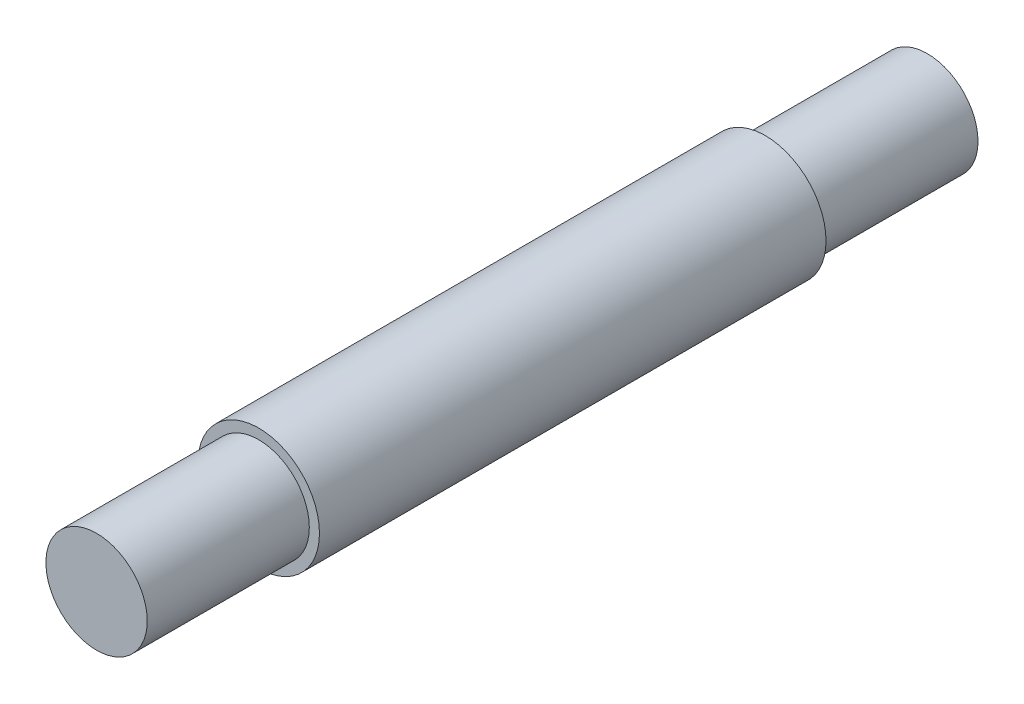
ISO-10303-21;
HEADER;
FILE_DESCRIPTION(('STEP AP214'),'2;1');
FILE_NAME('part.step','',(''),(''),'','','');
FILE_SCHEMA(('AUTOMOTIVE_DESIGN { 1 0 10303 214 1 1 1 1 }'));
ENDSEC;
DATA;
#1=APPLICATION_CONTEXT('core data for automotive mechanical design processes');
#2=APPLICATION_PROTOCOL_DEFINITION('international standard','automotive_design',2000,#1);
#3=PRODUCT_CONTEXT('',#1,'mechanical');
#4=PRODUCT('Part','Part','',(#3));
#5=PRODUCT_RELATED_PRODUCT_CATEGORY('part','',(#4));
#6=PRODUCT_DEFINITION_FORMATION('','',#4);
#7=PRODUCT_DEFINITION_CONTEXT('part definition',#1,'design');
#8=PRODUCT_DEFINITION('design','',#6,#7);
#9=PRODUCT_DEFINITION_SHAPE('','',#8);
#10=(LENGTH_UNIT() NAMED_UNIT(*) SI_UNIT(.MILLI.,.METRE.));
#11=(NAMED_UNIT(*) PLANE_ANGLE_UNIT() SI_UNIT($,.RADIAN.));
#12=(NAMED_UNIT(*) SI_UNIT($,.STERADIAN.) SOLID_ANGLE_UNIT());
#13=UNCERTAINTY_MEASURE_WITH_UNIT(LENGTH_MEASURE(1.E-05),#10,'distance_accuracy_value','');
#14=(GEOMETRIC_REPRESENTATION_CONTEXT(3) GLOBAL_UNCERTAINTY_ASSIGNED_CONTEXT((#13)) GLOBAL_UNIT_ASSIGNED_CONTEXT((#10,
#11,#12)) REPRESENTATION_CONTEXT('',''));
#15=CARTESIAN_POINT('',(0.,0.,0.));
#16=DIRECTION('',(0.,0.,1.));
#17=DIRECTION('',(1.,0.,0.));
#18=AXIS2_PLACEMENT_3D('',#15,#16,#17);
#19=CARTESIAN_POINT('',(0.,0.,82.));
#20=DIRECTION('',(0.,0.,-1.));
#21=DIRECTION('',(-1.,0.,0.));
#22=AXIS2_PLACEMENT_3D('',#19,#20,#21);
#23=CYLINDRICAL_SURFACE('',#22,5.);
#24=CARTESIAN_POINT('',(0.,0.,0.));
#25=DIRECTION('',(0.,0.,1.));
#26=DIRECTION('',(1.,0.,0.));
#27=AXIS2_PLACEMENT_3D('',#24,#25,#26);
#28=CIRCLE('',#27,5.);
#29=CARTESIAN_POINT('',(5.,0.,0.));
#30=VERTEX_POINT('',#29);
#31=EDGE_CURVE('E56',#30,#30,#28,.T.);
#32=ORIENTED_EDGE('',*,*,#31,.T.);
#33=EDGE_LOOP('',(#32));
#34=FACE_BOUND('',#33,.T.);
#35=CARTESIAN_POINT('',(0.,0.,16.));
#36=DIRECTION('',(0.,0.,1.));
#37=DIRECTION('',(1.,0.,0.));
#38=AXIS2_PLACEMENT_3D('',#35,#36,#37);
#39=CIRCLE('',#38,5.);
#40=CARTESIAN_POINT('',(5.,0.,16.));
#41=VERTEX_POINT('',#40);
#42=EDGE_CURVE('E10',#41,#41,#39,.T.);
#43=ORIENTED_EDGE('',*,*,#42,.F.);
#44=EDGE_LOOP('',(#43));
#45=FACE_BOUND('',#44,.T.);
#46=ADVANCED_FACE('F43',(#34,#45),#23,.T.);
#47=CARTESIAN_POINT('',(0.,0.,0.));
#48=DIRECTION('',(0.,0.,1.));
#49=DIRECTION('',(1.,0.,0.));
#50=AXIS2_PLACEMENT_3D('',#47,#48,#49);
#51=PLANE('',#50);
#52=ORIENTED_EDGE('',*,*,#31,.F.);
#53=EDGE_LOOP('',(#52));
#54=FACE_BOUND('',#53,.T.);
#55=ADVANCED_FACE('F85',(#54),#51,.F.);
#56=CARTESIAN_POINT('',(0.,0.,16.));
#57=DIRECTION('',(0.,0.,1.));
#58=DIRECTION('',(1.,0.,0.));
#59=AXIS2_PLACEMENT_3D('',#56,#57,#58);
#60=CYLINDRICAL_SURFACE('',#59,6.);
#61=CARTESIAN_POINT('',(0.,0.,16.));
#62=DIRECTION('',(0.,0.,1.));
#63=DIRECTION('',(1.,0.,0.));
#64=AXIS2_PLACEMENT_3D('',#61,#62,#63);
#65=CIRCLE('',#64,6.);
#66=CARTESIAN_POINT('',(6.,0.,16.));
#67=VERTEX_POINT('',#66);
#68=EDGE_CURVE('E69',#67,#67,#65,.T.);
#69=ORIENTED_EDGE('',*,*,#68,.T.);
#70=EDGE_LOOP('',(#69));
#71=FACE_BOUND('',#70,.T.);
#72=CARTESIAN_POINT('',(0.,0.,66.));
#73=DIRECTION('',(0.,0.,1.));
#74=DIRECTION('',(1.,0.,0.));
#75=AXIS2_PLACEMENT_3D('',#72,#73,#74);
#76=CIRCLE('',#75,6.);
#77=CARTESIAN_POINT('',(6.,0.,66.));
#78=VERTEX_POINT('',#77);
#79=EDGE_CURVE('E65',#78,#78,#76,.T.);
#80=ORIENTED_EDGE('',*,*,#79,.F.);
#81=EDGE_LOOP('',(#80));
#82=FACE_BOUND('',#81,.T.);
#83=ADVANCED_FACE('F82',(#71,#82),#60,.T.);
#84=CARTESIAN_POINT('',(0.,0.,16.));
#85=DIRECTION('',(0.,0.,1.));
#86=DIRECTION('',(1.,0.,0.));
#87=AXIS2_PLACEMENT_3D('',#84,#85,#86);
#88=PLANE('',#87);
#89=ORIENTED_EDGE('',*,*,#42,.T.);
#90=EDGE_LOOP('',(#89));
#91=FACE_BOUND('',#90,.T.);
#92=ORIENTED_EDGE('',*,*,#68,.F.);
#93=EDGE_LOOP('',(#92));
#94=FACE_BOUND('',#93,.T.);
#95=ADVANCED_FACE('F84',(#91,#94),#88,.F.);
#96=CARTESIAN_POINT('',(0.,0.,66.));
#97=DIRECTION('',(0.,0.,1.));
#98=DIRECTION('',(1.,0.,0.));
#99=AXIS2_PLACEMENT_3D('',#96,#97,#98);
#100=PLANE('',#99);
#101=CARTESIAN_POINT('',(0.,0.,66.));
#102=DIRECTION('',(0.,0.,1.));
#103=DIRECTION('',(1.,0.,0.));
#104=AXIS2_PLACEMENT_3D('',#101,#102,#103);
#105=CIRCLE('',#104,5.);
#106=CARTESIAN_POINT('',(5.,0.,66.));
#107=VERTEX_POINT('',#106);
#108=EDGE_CURVE('E62',#107,#107,#105,.T.);
#109=ORIENTED_EDGE('',*,*,#108,.F.);
#110=EDGE_LOOP('',(#109));
#111=FACE_BOUND('',#110,.T.);
#112=ORIENTED_EDGE('',*,*,#79,.T.);
#113=EDGE_LOOP('',(#112));
#114=FACE_BOUND('',#113,.T.);
#115=ADVANCED_FACE('F80',(#111,#114),#100,.T.);
#116=CARTESIAN_POINT('',(0.,0.,82.));
#117=DIRECTION('',(0.,0.,1.));
#118=DIRECTION('',(1.,0.,0.));
#119=AXIS2_PLACEMENT_3D('',#116,#117,#118);
#120=PLANE('',#119);
#121=CARTESIAN_POINT('',(0.,0.,82.));
#122=DIRECTION('',(0.,0.,1.));
#123=DIRECTION('',(1.,0.,0.));
#124=AXIS2_PLACEMENT_3D('',#121,#122,#123);
#125=CIRCLE('',#124,5.);
#126=CARTESIAN_POINT('',(5.,0.,82.));
#127=VERTEX_POINT('',#126);
#128=EDGE_CURVE('E51',#127,#127,#125,.T.);
#129=ORIENTED_EDGE('',*,*,#128,.T.);
#130=EDGE_LOOP('',(#129));
#131=FACE_BOUND('',#130,.T.);
#132=ADVANCED_FACE('F101',(#131),#120,.T.);
#133=ORIENTED_EDGE('',*,*,#108,.T.);
#134=EDGE_LOOP('',(#133));
#135=FACE_BOUND('',#134,.T.);
#136=ORIENTED_EDGE('',*,*,#128,.F.);
#137=EDGE_LOOP('',(#136));
#138=FACE_BOUND('',#137,.T.);
#139=ADVANCED_FACE('F45',(#135,#138),#23,.T.);
#140=CLOSED_SHELL('',(#46,#55,#83,#95,#115,#132,#139));
#141=MANIFOLD_SOLID_BREP('B2',#140);
#142=ADVANCED_BREP_SHAPE_REPRESENTATION('',(#18,#141),#14);
#143=SHAPE_DEFINITION_REPRESENTATION(#9,#142);
ENDSEC;
END-ISO-10303-21;
